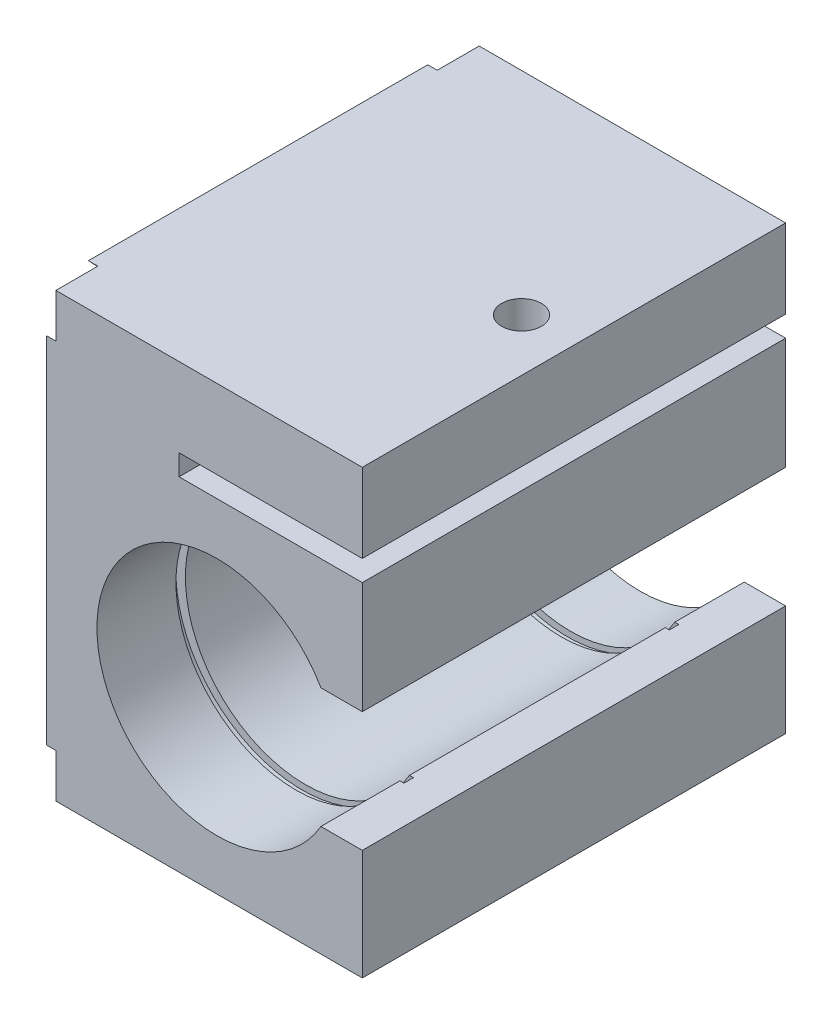
ISO-10303-21;
HEADER;
FILE_DESCRIPTION(('STEP AP214'),'2;1');
FILE_NAME('part.step','',(''),(''),'','','');
FILE_SCHEMA(('AUTOMOTIVE_DESIGN { 1 0 10303 214 1 1 1 1 }'));
ENDSEC;
DATA;
#1=APPLICATION_CONTEXT('core data for automotive mechanical design processes');
#2=APPLICATION_PROTOCOL_DEFINITION('international standard','automotive_design',2000,#1);
#3=PRODUCT_CONTEXT('',#1,'mechanical');
#4=PRODUCT('Part','Part','',(#3));
#5=PRODUCT_RELATED_PRODUCT_CATEGORY('part','',(#4));
#6=PRODUCT_DEFINITION_FORMATION('','',#4);
#7=PRODUCT_DEFINITION_CONTEXT('part definition',#1,'design');
#8=PRODUCT_DEFINITION('design','',#6,#7);
#9=PRODUCT_DEFINITION_SHAPE('','',#8);
#10=(LENGTH_UNIT() NAMED_UNIT(*) SI_UNIT(.MILLI.,.METRE.));
#11=(NAMED_UNIT(*) PLANE_ANGLE_UNIT() SI_UNIT($,.RADIAN.));
#12=(NAMED_UNIT(*) SI_UNIT($,.STERADIAN.) SOLID_ANGLE_UNIT());
#13=UNCERTAINTY_MEASURE_WITH_UNIT(LENGTH_MEASURE(1.E-05),#10,'distance_accuracy_value','');
#14=(GEOMETRIC_REPRESENTATION_CONTEXT(3) GLOBAL_UNCERTAINTY_ASSIGNED_CONTEXT((#13)) GLOBAL_UNIT_ASSIGNED_CONTEXT((#10,
#11,#12)) REPRESENTATION_CONTEXT('',''));
#15=CARTESIAN_POINT('',(0.,0.,0.));
#16=DIRECTION('',(0.,0.,1.));
#17=DIRECTION('',(1.,0.,0.));
#18=AXIS2_PLACEMENT_3D('',#15,#16,#17);
#19=CARTESIAN_POINT('',(27.,27.,67.));
#20=DIRECTION('',(0.,0.,-1.));
#21=DIRECTION('',(-1.,0.,0.));
#22=AXIS2_PLACEMENT_3D('',#19,#20,#21);
#23=CYLINDRICAL_SURFACE('',#22,19.);
#24=DIRECTION('',(0.,0.,-1.));
#25=VECTOR('',#24,1.);
#26=CARTESIAN_POINT('',(43.4544826719043,17.5,67.));
#27=LINE('',#26,#25);
#28=CARTESIAN_POINT('',(43.4544826719043,17.5,53.));
#29=VERTEX_POINT('',#28);
#30=CARTESIAN_POINT('',(43.4544826719043,17.5,12.5));
#31=VERTEX_POINT('',#30);
#32=EDGE_CURVE('E309',#29,#31,#27,.T.);
#33=ORIENTED_EDGE('',*,*,#32,.T.);
#34=CARTESIAN_POINT('',(27.,27.,12.5));
#35=DIRECTION('',(0.,0.,1.));
#36=DIRECTION('',(1.,0.,0.));
#37=AXIS2_PLACEMENT_3D('',#34,#35,#36);
#38=CIRCLE('',#37,19.);
#39=CARTESIAN_POINT('',(43.4544826719043,36.5,12.5));
#40=VERTEX_POINT('',#39);
#41=EDGE_CURVE('E476',#31,#40,#38,.F.);
#42=ORIENTED_EDGE('',*,*,#41,.T.);
#43=DIRECTION('',(0.,0.,-1.));
#44=VECTOR('',#43,1.);
#45=CARTESIAN_POINT('',(43.4544826719043,36.5,67.));
#46=LINE('',#45,#44);
#47=CARTESIAN_POINT('',(43.4544826719043,36.5,53.));
#48=VERTEX_POINT('',#47);
#49=EDGE_CURVE('E314',#48,#40,#46,.T.);
#50=ORIENTED_EDGE('',*,*,#49,.F.);
#51=CARTESIAN_POINT('',(27.,27.,53.));
#52=DIRECTION('',(0.,0.,-1.));
#53=DIRECTION('',(-1.,0.,0.));
#54=AXIS2_PLACEMENT_3D('',#51,#52,#53);
#55=CIRCLE('',#54,19.);
#56=EDGE_CURVE('E60',#48,#29,#55,.F.);
#57=ORIENTED_EDGE('',*,*,#56,.T.);
#58=EDGE_LOOP('',(#33,#42,#50,#57));
#59=FACE_BOUND('',#58,.T.);
#60=ADVANCED_FACE('F37',(#59),#23,.F.);
#61=CARTESIAN_POINT('',(43.4544826719043,17.5,67.));
#62=VERTEX_POINT('',#61);
#63=CARTESIAN_POINT('',(43.4544826719043,17.5,54.5));
#64=VERTEX_POINT('',#63);
#65=EDGE_CURVE('E306',#62,#64,#27,.T.);
#66=ORIENTED_EDGE('',*,*,#65,.T.);
#67=CARTESIAN_POINT('',(27.,27.,54.5));
#68=DIRECTION('',(0.,0.,1.));
#69=DIRECTION('',(1.,0.,0.));
#70=AXIS2_PLACEMENT_3D('',#67,#68,#69);
#71=CIRCLE('',#70,19.);
#72=CARTESIAN_POINT('',(43.4544826719043,36.5,54.5));
#73=VERTEX_POINT('',#72);
#74=EDGE_CURVE('E457',#64,#73,#71,.F.);
#75=ORIENTED_EDGE('',*,*,#74,.T.);
#76=CARTESIAN_POINT('',(43.4544826719043,36.5,67.));
#77=VERTEX_POINT('',#76);
#78=EDGE_CURVE('E311',#77,#73,#46,.T.);
#79=ORIENTED_EDGE('',*,*,#78,.F.);
#80=CARTESIAN_POINT('',(27.,27.,67.));
#81=DIRECTION('',(0.,0.,-1.));
#82=DIRECTION('',(1.,0.,0.));
#83=AXIS2_PLACEMENT_3D('',#80,#81,#82);
#84=CIRCLE('',#83,19.);
#85=EDGE_CURVE('E382',#62,#77,#84,.T.);
#86=ORIENTED_EDGE('',*,*,#85,.F.);
#87=EDGE_LOOP('',(#66,#75,#79,#86));
#88=FACE_BOUND('',#87,.T.);
#89=ADVANCED_FACE('F507',(#88),#23,.F.);
#90=CARTESIAN_POINT('',(0.,0.,67.));
#91=DIRECTION('',(1.,0.,0.));
#92=DIRECTION('',(0.,0.,-1.));
#93=AXIS2_PLACEMENT_3D('',#90,#91,#92);
#94=PLANE('',#93);
#95=DIRECTION('',(0.,0.,-1.));
#96=VECTOR('',#95,1.);
#97=CARTESIAN_POINT('',(0.,70.,67.));
#98=LINE('',#97,#96);
#99=CARTESIAN_POINT('',(0.,70.,60.355644408636));
#100=VERTEX_POINT('',#99);
#101=CARTESIAN_POINT('',(0.,70.,6.644355591364));
#102=VERTEX_POINT('',#101);
#103=EDGE_CURVE('E334',#100,#102,#98,.T.);
#104=ORIENTED_EDGE('',*,*,#103,.T.);
#105=DIRECTION('',(0.,0.722417687313246,-0.691456929285535));
#106=VECTOR('',#105,1.);
#107=CARTESIAN_POINT('',(0.,73.3189932605706,3.4676048991036));
#108=LINE('',#107,#106);
#109=CARTESIAN_POINT('',(0.,41.9418640506788,33.5));
#110=VERTEX_POINT('',#109);
#111=EDGE_CURVE('E435',#110,#102,#108,.T.);
#112=ORIENTED_EDGE('',*,*,#111,.F.);
#113=DIRECTION('',(0.,-0.722417687313246,-0.691456929285535));
#114=VECTOR('',#113,1.);
#115=CARTESIAN_POINT('',(0.,73.318993260571,63.5323951008968));
#116=LINE('',#115,#114);
#117=EDGE_CURVE('E420',#100,#110,#116,.T.);
#118=ORIENTED_EDGE('',*,*,#117,.F.);
#119=EDGE_LOOP('',(#104,#112,#118));
#120=FACE_BOUND('',#119,.T.);
#121=ADVANCED_FACE('F514',(#120),#94,.F.);
#122=DIRECTION('',(0.,-1.,0.));
#123=VECTOR('',#122,1.);
#124=CARTESIAN_POINT('',(0.,0.,67.));
#125=LINE('',#124,#123);
#126=CARTESIAN_POINT('',(0.,63.0581359493212,67.));
#127=VERTEX_POINT('',#126);
#128=CARTESIAN_POINT('',(0.,6.94186405067878,67.));
#129=VERTEX_POINT('',#128);
#130=EDGE_CURVE('E341',#127,#129,#125,.T.);
#131=ORIENTED_EDGE('',*,*,#130,.F.);
#132=DIRECTION('',(0.,0.722417687313245,0.691456929285535));
#133=VECTOR('',#132,1.);
#134=CARTESIAN_POINT('',(0.,66.6810067394298,70.467604899104));
#135=LINE('',#134,#133);
#136=CARTESIAN_POINT('',(0.,35.,40.144355591364));
#137=VERTEX_POINT('',#136);
#138=EDGE_CURVE('E423',#137,#127,#135,.T.);
#139=ORIENTED_EDGE('',*,*,#138,.F.);
#140=DIRECTION('',(0.,0.722417687313246,-0.691456929285535));
#141=VECTOR('',#140,1.);
#142=CARTESIAN_POINT('',(0.,35.,40.144355591364));
#143=LINE('',#142,#141);
#144=EDGE_CURVE('E425',#129,#137,#143,.T.);
#145=ORIENTED_EDGE('',*,*,#144,.F.);
#146=EDGE_LOOP('',(#131,#139,#145));
#147=FACE_BOUND('',#146,.T.);
#148=ADVANCED_FACE('F614',(#147),#94,.F.);
#149=DIRECTION('',(0.,0.,-1.));
#150=VECTOR('',#149,1.);
#151=CARTESIAN_POINT('',(0.,0.,67.));
#152=LINE('',#151,#150);
#153=CARTESIAN_POINT('',(0.,0.,60.355644408636));
#154=VERTEX_POINT('',#153);
#155=CARTESIAN_POINT('',(0.,0.,6.644355591364));
#156=VERTEX_POINT('',#155);
#157=EDGE_CURVE('E297',#154,#156,#152,.T.);
#158=ORIENTED_EDGE('',*,*,#157,.F.);
#159=DIRECTION('',(0.,-0.722417687313246,0.691456929285535));
#160=VECTOR('',#159,1.);
#161=CARTESIAN_POINT('',(0.,28.0581359493212,33.5));
#162=LINE('',#161,#160);
#163=CARTESIAN_POINT('',(0.,28.0581359493212,33.5));
#164=VERTEX_POINT('',#163);
#165=EDGE_CURVE('E427',#164,#154,#162,.T.);
#166=ORIENTED_EDGE('',*,*,#165,.F.);
#167=DIRECTION('',(0.,0.722417687313246,0.691456929285535));
#168=VECTOR('',#167,1.);
#169=CARTESIAN_POINT('',(0.,28.0581359493212,33.5));
#170=LINE('',#169,#168);
#171=EDGE_CURVE('E429',#156,#164,#170,.T.);
#172=ORIENTED_EDGE('',*,*,#171,.F.);
#173=EDGE_LOOP('',(#158,#166,#172));
#174=FACE_BOUND('',#173,.T.);
#175=ADVANCED_FACE('F535',(#174),#94,.F.);
#176=DIRECTION('',(0.,-1.,0.));
#177=VECTOR('',#176,1.);
#178=CARTESIAN_POINT('',(0.,0.,0.));
#179=LINE('',#178,#177);
#180=CARTESIAN_POINT('',(0.,63.0581359493212,0.));
#181=VERTEX_POINT('',#180);
#182=CARTESIAN_POINT('',(0.,6.94186405067879,0.));
#183=VERTEX_POINT('',#182);
#184=EDGE_CURVE('E364',#181,#183,#179,.T.);
#185=ORIENTED_EDGE('',*,*,#184,.T.);
#186=DIRECTION('',(0.,-0.722417687313246,-0.691456929285535));
#187=VECTOR('',#186,1.);
#188=CARTESIAN_POINT('',(0.,35.,26.855644408636));
#189=LINE('',#188,#187);
#190=CARTESIAN_POINT('',(0.,35.,26.855644408636));
#191=VERTEX_POINT('',#190);
#192=EDGE_CURVE('E431',#191,#183,#189,.T.);
#193=ORIENTED_EDGE('',*,*,#192,.F.);
#194=DIRECTION('',(0.,-0.722417687313245,0.691456929285535));
#195=VECTOR('',#194,1.);
#196=CARTESIAN_POINT('',(0.,66.6810067394294,-3.46760489910359));
#197=LINE('',#196,#195);
#198=EDGE_CURVE('E433',#181,#191,#197,.T.);
#199=ORIENTED_EDGE('',*,*,#198,.F.);
#200=EDGE_LOOP('',(#185,#193,#199));
#201=FACE_BOUND('',#200,.T.);
#202=ADVANCED_FACE('F39',(#201),#94,.F.);
#203=CARTESIAN_POINT('',(0.,0.,67.));
#204=DIRECTION('',(0.,1.,0.));
#205=DIRECTION('',(0.,0.,1.));
#206=AXIS2_PLACEMENT_3D('',#203,#204,#205);
#207=PLANE('',#206);
#208=ORIENTED_EDGE('',*,*,#157,.T.);
#209=DIRECTION('',(1.,0.,0.));
#210=VECTOR('',#209,1.);
#211=CARTESIAN_POINT('',(0.,0.,6.644355591364));
#212=LINE('',#211,#210);
#213=CARTESIAN_POINT('',(1.5,0.,6.644355591364));
#214=VERTEX_POINT('',#213);
#215=EDGE_CURVE('E272',#156,#214,#212,.T.);
#216=ORIENTED_EDGE('',*,*,#215,.T.);
#217=DIRECTION('',(0.,0.,1.));
#218=VECTOR('',#217,1.);
#219=CARTESIAN_POINT('',(1.5,0.,67.));
#220=LINE('',#219,#218);
#221=CARTESIAN_POINT('',(1.5,0.,0.));
#222=VERTEX_POINT('',#221);
#223=EDGE_CURVE('E405',#222,#214,#220,.T.);
#224=ORIENTED_EDGE('',*,*,#223,.F.);
#225=DIRECTION('',(1.,0.,0.));
#226=VECTOR('',#225,1.);
#227=CARTESIAN_POINT('',(0.,0.,0.));
#228=LINE('',#227,#226);
#229=CARTESIAN_POINT('',(50.,0.,0.));
#230=VERTEX_POINT('',#229);
#231=EDGE_CURVE('E362',#222,#230,#228,.T.);
#232=ORIENTED_EDGE('',*,*,#231,.T.);
#233=DIRECTION('',(0.,0.,-1.));
#234=VECTOR('',#233,1.);
#235=CARTESIAN_POINT('',(50.,0.,67.));
#236=LINE('',#235,#234);
#237=CARTESIAN_POINT('',(50.,0.,67.));
#238=VERTEX_POINT('',#237);
#239=EDGE_CURVE('E300',#238,#230,#236,.T.);
#240=ORIENTED_EDGE('',*,*,#239,.F.);
#241=DIRECTION('',(1.,0.,0.));
#242=VECTOR('',#241,1.);
#243=CARTESIAN_POINT('',(0.,0.,67.));
#244=LINE('',#243,#242);
#245=CARTESIAN_POINT('',(1.5,0.,67.));
#246=VERTEX_POINT('',#245);
#247=EDGE_CURVE('E388',#246,#238,#244,.T.);
#248=ORIENTED_EDGE('',*,*,#247,.F.);
#249=CARTESIAN_POINT('',(1.5,0.,60.355644408636));
#250=VERTEX_POINT('',#249);
#251=EDGE_CURVE('E401',#250,#246,#220,.T.);
#252=ORIENTED_EDGE('',*,*,#251,.F.);
#253=DIRECTION('',(-1.,0.,0.));
#254=VECTOR('',#253,1.);
#255=CARTESIAN_POINT('',(0.,0.,60.355644408636));
#256=LINE('',#255,#254);
#257=EDGE_CURVE('E275',#250,#154,#256,.T.);
#258=ORIENTED_EDGE('',*,*,#257,.T.);
#259=EDGE_LOOP('',(#208,#216,#224,#232,#240,#248,#252,#258));
#260=FACE_BOUND('',#259,.T.);
#261=ADVANCED_FACE('F527',(#260),#207,.F.);
#262=CARTESIAN_POINT('',(50.,0.,67.));
#263=DIRECTION('',(-1.,0.,0.));
#264=DIRECTION('',(0.,0.,1.));
#265=AXIS2_PLACEMENT_3D('',#262,#263,#264);
#266=PLANE('',#265);
#267=DIRECTION('',(0.,1.,0.));
#268=VECTOR('',#267,1.);
#269=CARTESIAN_POINT('',(50.,0.,0.));
#270=LINE('',#269,#268);
#271=CARTESIAN_POINT('',(50.,17.5,0.));
#272=VERTEX_POINT('',#271);
#273=EDGE_CURVE('E360',#230,#272,#270,.T.);
#274=ORIENTED_EDGE('',*,*,#273,.T.);
#275=DIRECTION('',(0.,0.,-1.));
#276=VECTOR('',#275,1.);
#277=CARTESIAN_POINT('',(50.,17.5,67.));
#278=LINE('',#277,#276);
#279=CARTESIAN_POINT('',(50.,17.5,67.));
#280=VERTEX_POINT('',#279);
#281=EDGE_CURVE('E303',#280,#272,#278,.T.);
#282=ORIENTED_EDGE('',*,*,#281,.F.);
#283=DIRECTION('',(0.,1.,0.));
#284=VECTOR('',#283,1.);
#285=CARTESIAN_POINT('',(50.,0.,67.));
#286=LINE('',#285,#284);
#287=EDGE_CURVE('E386',#238,#280,#286,.T.);
#288=ORIENTED_EDGE('',*,*,#287,.F.);
#289=ORIENTED_EDGE('',*,*,#239,.T.);
#290=EDGE_LOOP('',(#274,#282,#288,#289));
#291=FACE_BOUND('',#290,.T.);
#292=ADVANCED_FACE('F523',(#291),#266,.F.);
#293=CARTESIAN_POINT('',(43.4544826719043,17.5,67.));
#294=DIRECTION('',(0.,-1.,0.));
#295=DIRECTION('',(0.,0.,-1.));
#296=AXIS2_PLACEMENT_3D('',#293,#294,#295);
#297=PLANE('',#296);
#298=DIRECTION('',(0.,0.,1.));
#299=VECTOR('',#298,1.);
#300=CARTESIAN_POINT('',(44.0910662523071,17.5,24.2363093368867));
#301=LINE('',#300,#299);
#302=CARTESIAN_POINT('',(44.0910662523071,17.5,11.));
#303=VERTEX_POINT('',#302);
#304=CARTESIAN_POINT('',(44.0910662523071,17.5,12.5));
#305=VERTEX_POINT('',#304);
#306=EDGE_CURVE('E259',#303,#305,#301,.T.);
#307=ORIENTED_EDGE('',*,*,#306,.T.);
#308=DIRECTION('',(-1.,0.,0.));
#309=VECTOR('',#308,1.);
#310=CARTESIAN_POINT('',(43.4544826719043,17.5,12.5));
#311=LINE('',#310,#309);
#312=EDGE_CURVE('E473',#305,#31,#311,.T.);
#313=ORIENTED_EDGE('',*,*,#312,.T.);
#314=ORIENTED_EDGE('',*,*,#32,.F.);
#315=DIRECTION('',(1.,0.,0.));
#316=VECTOR('',#315,1.);
#317=CARTESIAN_POINT('',(43.4544826719043,17.5,53.));
#318=LINE('',#317,#316);
#319=CARTESIAN_POINT('',(44.0910662523071,17.5,53.));
#320=VERTEX_POINT('',#319);
#321=EDGE_CURVE('E463',#29,#320,#318,.T.);
#322=ORIENTED_EDGE('',*,*,#321,.T.);
#323=DIRECTION('',(0.,0.,1.));
#324=VECTOR('',#323,1.);
#325=CARTESIAN_POINT('',(44.0910662523071,17.5,66.2363093368867));
#326=LINE('',#325,#324);
#327=CARTESIAN_POINT('',(44.0910662523071,17.5,54.5));
#328=VERTEX_POINT('',#327);
#329=EDGE_CURVE('E460',#320,#328,#326,.T.);
#330=ORIENTED_EDGE('',*,*,#329,.T.);
#331=DIRECTION('',(-1.,0.,0.));
#332=VECTOR('',#331,1.);
#333=CARTESIAN_POINT('',(43.4544826719043,17.5,54.5));
#334=LINE('',#333,#332);
#335=EDGE_CURVE('E437',#328,#64,#334,.T.);
#336=ORIENTED_EDGE('',*,*,#335,.T.);
#337=ORIENTED_EDGE('',*,*,#65,.F.);
#338=DIRECTION('',(-1.,0.,0.));
#339=VECTOR('',#338,1.);
#340=CARTESIAN_POINT('',(43.4544826719043,17.5,67.));
#341=LINE('',#340,#339);
#342=EDGE_CURVE('E384',#280,#62,#341,.T.);
#343=ORIENTED_EDGE('',*,*,#342,.F.);
#344=ORIENTED_EDGE('',*,*,#281,.T.);
#345=DIRECTION('',(-1.,0.,0.));
#346=VECTOR('',#345,1.);
#347=CARTESIAN_POINT('',(43.4544826719043,17.5,0.));
#348=LINE('',#347,#346);
#349=CARTESIAN_POINT('',(43.4544826719043,17.5,0.));
#350=VERTEX_POINT('',#349);
#351=EDGE_CURVE('E357',#272,#350,#348,.T.);
#352=ORIENTED_EDGE('',*,*,#351,.T.);
#353=CARTESIAN_POINT('',(43.4544826719043,17.5,11.));
#354=VERTEX_POINT('',#353);
#355=EDGE_CURVE('E310',#354,#350,#27,.T.);
#356=ORIENTED_EDGE('',*,*,#355,.F.);
#357=DIRECTION('',(1.,0.,0.));
#358=VECTOR('',#357,1.);
#359=CARTESIAN_POINT('',(43.4544826719043,17.5,11.));
#360=LINE('',#359,#358);
#361=EDGE_CURVE('E480',#354,#303,#360,.T.);
#362=ORIENTED_EDGE('',*,*,#361,.T.);
#363=EDGE_LOOP('',(#307,#313,#314,#322,#330,#336,#337,#343,#344,#352,#356,#362));
#364=FACE_BOUND('',#363,.T.);
#365=ADVANCED_FACE('F485',(#364),#297,.F.);
#366=CARTESIAN_POINT('',(43.4544826719043,36.5,11.));
#367=VERTEX_POINT('',#366);
#368=CARTESIAN_POINT('',(43.4544826719043,36.5,0.));
#369=VERTEX_POINT('',#368);
#370=EDGE_CURVE('E315',#367,#369,#46,.T.);
#371=ORIENTED_EDGE('',*,*,#370,.F.);
#372=CARTESIAN_POINT('',(27.,27.,11.));
#373=DIRECTION('',(0.,0.,-1.));
#374=DIRECTION('',(-1.,0.,0.));
#375=AXIS2_PLACEMENT_3D('',#372,#373,#374);
#376=CIRCLE('',#375,19.);
#377=EDGE_CURVE('E52',#367,#354,#376,.F.);
#378=ORIENTED_EDGE('',*,*,#377,.T.);
#379=ORIENTED_EDGE('',*,*,#355,.T.);
#380=CARTESIAN_POINT('',(27.,27.,0.));
#381=DIRECTION('',(0.,0.,-1.));
#382=DIRECTION('',(1.,0.,0.));
#383=AXIS2_PLACEMENT_3D('',#380,#381,#382);
#384=CIRCLE('',#383,19.);
#385=EDGE_CURVE('E354',#350,#369,#384,.T.);
#386=ORIENTED_EDGE('',*,*,#385,.T.);
#387=EDGE_LOOP('',(#371,#378,#379,#386));
#388=FACE_BOUND('',#387,.T.);
#389=ADVANCED_FACE('F490',(#388),#23,.F.);
#390=CARTESIAN_POINT('',(50.,36.5,67.));
#391=DIRECTION('',(0.,1.,0.));
#392=DIRECTION('',(0.,0.,1.));
#393=AXIS2_PLACEMENT_3D('',#390,#391,#392);
#394=PLANE('',#393);
#395=ORIENTED_EDGE('',*,*,#49,.T.);
#396=DIRECTION('',(1.,0.,0.));
#397=VECTOR('',#396,1.);
#398=CARTESIAN_POINT('',(50.,36.5,12.5));
#399=LINE('',#398,#397);
#400=CARTESIAN_POINT('',(44.0910662523071,36.5,12.5));
#401=VERTEX_POINT('',#400);
#402=EDGE_CURVE('E11',#40,#401,#399,.T.);
#403=ORIENTED_EDGE('',*,*,#402,.T.);
#404=DIRECTION('',(0.,0.,1.));
#405=VECTOR('',#404,1.);
#406=CARTESIAN_POINT('',(44.0910662523071,36.5,24.2363093368867));
#407=LINE('',#406,#405);
#408=CARTESIAN_POINT('',(44.0910662523071,36.5,11.));
#409=VERTEX_POINT('',#408);
#410=EDGE_CURVE('E45',#401,#409,#407,.F.);
#411=ORIENTED_EDGE('',*,*,#410,.T.);
#412=DIRECTION('',(-1.,0.,0.));
#413=VECTOR('',#412,1.);
#414=CARTESIAN_POINT('',(50.,36.5,11.));
#415=LINE('',#414,#413);
#416=EDGE_CURVE('E244',#409,#367,#415,.T.);
#417=ORIENTED_EDGE('',*,*,#416,.T.);
#418=ORIENTED_EDGE('',*,*,#370,.T.);
#419=DIRECTION('',(1.,0.,0.));
#420=VECTOR('',#419,1.);
#421=CARTESIAN_POINT('',(50.,36.5,0.));
#422=LINE('',#421,#420);
#423=CARTESIAN_POINT('',(50.,36.5,0.));
#424=VERTEX_POINT('',#423);
#425=EDGE_CURVE('E352',#369,#424,#422,.T.);
#426=ORIENTED_EDGE('',*,*,#425,.T.);
#427=DIRECTION('',(0.,0.,-1.));
#428=VECTOR('',#427,1.);
#429=CARTESIAN_POINT('',(50.,36.5,67.));
#430=LINE('',#429,#428);
#431=CARTESIAN_POINT('',(50.,36.5,67.));
#432=VERTEX_POINT('',#431);
#433=EDGE_CURVE('E316',#432,#424,#430,.T.);
#434=ORIENTED_EDGE('',*,*,#433,.F.);
#435=DIRECTION('',(1.,0.,0.));
#436=VECTOR('',#435,1.);
#437=CARTESIAN_POINT('',(50.,36.5,67.));
#438=LINE('',#437,#436);
#439=EDGE_CURVE('E380',#77,#432,#438,.T.);
#440=ORIENTED_EDGE('',*,*,#439,.F.);
#441=ORIENTED_EDGE('',*,*,#78,.T.);
#442=DIRECTION('',(1.,0.,0.));
#443=VECTOR('',#442,1.);
#444=CARTESIAN_POINT('',(50.,36.5,54.5));
#445=LINE('',#444,#443);
#446=CARTESIAN_POINT('',(44.0910662523071,36.5,54.5));
#447=VERTEX_POINT('',#446);
#448=EDGE_CURVE('E252',#73,#447,#445,.T.);
#449=ORIENTED_EDGE('',*,*,#448,.T.);
#450=DIRECTION('',(0.,0.,1.));
#451=VECTOR('',#450,1.);
#452=CARTESIAN_POINT('',(44.0910662523071,36.5,66.2363093368867));
#453=LINE('',#452,#451);
#454=CARTESIAN_POINT('',(44.0910662523071,36.5,53.));
#455=VERTEX_POINT('',#454);
#456=EDGE_CURVE('E267',#447,#455,#453,.F.);
#457=ORIENTED_EDGE('',*,*,#456,.T.);
#458=DIRECTION('',(-1.,0.,0.));
#459=VECTOR('',#458,1.);
#460=CARTESIAN_POINT('',(50.,36.5,53.));
#461=LINE('',#460,#459);
#462=EDGE_CURVE('E270',#455,#48,#461,.T.);
#463=ORIENTED_EDGE('',*,*,#462,.T.);
#464=EDGE_LOOP('',(#395,#403,#411,#417,#418,#426,#434,#440,#441,#449,#457,#463));
#465=FACE_BOUND('',#464,.T.);
#466=ADVANCED_FACE('F263',(#465),#394,.F.);
#467=CARTESIAN_POINT('',(50.,36.5,67.));
#468=DIRECTION('',(-1.,0.,0.));
#469=DIRECTION('',(0.,0.,1.));
#470=AXIS2_PLACEMENT_3D('',#467,#468,#469);
#471=PLANE('',#470);
#472=DIRECTION('',(0.,1.,0.));
#473=VECTOR('',#472,1.);
#474=CARTESIAN_POINT('',(50.,36.5,0.));
#475=LINE('',#474,#473);
#476=CARTESIAN_POINT('',(50.,54.2,0.));
#477=VERTEX_POINT('',#476);
#478=EDGE_CURVE('E350',#424,#477,#475,.T.);
#479=ORIENTED_EDGE('',*,*,#478,.T.);
#480=DIRECTION('',(0.,0.,-1.));
#481=VECTOR('',#480,1.);
#482=CARTESIAN_POINT('',(50.,54.2,67.));
#483=LINE('',#482,#481);
#484=CARTESIAN_POINT('',(50.,54.2,67.));
#485=VERTEX_POINT('',#484);
#486=EDGE_CURVE('E319',#485,#477,#483,.T.);
#487=ORIENTED_EDGE('',*,*,#486,.F.);
#488=DIRECTION('',(0.,1.,0.));
#489=VECTOR('',#488,1.);
#490=CARTESIAN_POINT('',(50.,36.5,67.));
#491=LINE('',#490,#489);
#492=EDGE_CURVE('E378',#432,#485,#491,.T.);
#493=ORIENTED_EDGE('',*,*,#492,.F.);
#494=ORIENTED_EDGE('',*,*,#433,.T.);
#495=EDGE_LOOP('',(#479,#487,#493,#494));
#496=FACE_BOUND('',#495,.T.);
#497=ADVANCED_FACE('F522',(#496),#471,.F.);
#498=CARTESIAN_POINT('',(50.,54.2,67.));
#499=DIRECTION('',(0.,-1.,0.));
#500=DIRECTION('',(1.,0.,0.));
#501=AXIS2_PLACEMENT_3D('',#498,#499,#500);
#502=PLANE('',#501);
#503=DIRECTION('',(-1.,0.,0.));
#504=VECTOR('',#503,1.);
#505=CARTESIAN_POINT('',(50.,54.2,0.));
#506=LINE('',#505,#504);
#507=CARTESIAN_POINT('',(21.,54.2,0.));
#508=VERTEX_POINT('',#507);
#509=EDGE_CURVE('E348',#477,#508,#506,.T.);
#510=ORIENTED_EDGE('',*,*,#509,.T.);
#511=DIRECTION('',(0.,0.,-1.));
#512=VECTOR('',#511,1.);
#513=CARTESIAN_POINT('',(21.,54.2,67.));
#514=LINE('',#513,#512);
#515=CARTESIAN_POINT('',(21.,54.2,67.));
#516=VERTEX_POINT('',#515);
#517=EDGE_CURVE('E322',#516,#508,#514,.T.);
#518=ORIENTED_EDGE('',*,*,#517,.F.);
#519=DIRECTION('',(-1.,0.,0.));
#520=VECTOR('',#519,1.);
#521=CARTESIAN_POINT('',(50.,54.2,67.));
#522=LINE('',#521,#520);
#523=EDGE_CURVE('E376',#485,#516,#522,.T.);
#524=ORIENTED_EDGE('',*,*,#523,.F.);
#525=ORIENTED_EDGE('',*,*,#486,.T.);
#526=EDGE_LOOP('',(#510,#518,#524,#525));
#527=FACE_BOUND('',#526,.T.);
#528=ADVANCED_FACE('F846',(#527),#502,.F.);
#529=CARTESIAN_POINT('',(21.,57.5,67.));
#530=DIRECTION('',(-1.,0.,0.));
#531=DIRECTION('',(0.,0.,1.));
#532=AXIS2_PLACEMENT_3D('',#529,#530,#531);
#533=PLANE('',#532);
#534=DIRECTION('',(0.,1.,0.));
#535=VECTOR('',#534,1.);
#536=CARTESIAN_POINT('',(21.,57.5,0.));
#537=LINE('',#536,#535);
#538=CARTESIAN_POINT('',(21.,57.5,0.));
#539=VERTEX_POINT('',#538);
#540=EDGE_CURVE('E346',#508,#539,#537,.T.);
#541=ORIENTED_EDGE('',*,*,#540,.T.);
#542=DIRECTION('',(0.,0.,-1.));
#543=VECTOR('',#542,1.);
#544=CARTESIAN_POINT('',(21.,57.5,67.));
#545=LINE('',#544,#543);
#546=CARTESIAN_POINT('',(21.,57.5,67.));
#547=VERTEX_POINT('',#546);
#548=EDGE_CURVE('E325',#547,#539,#545,.T.);
#549=ORIENTED_EDGE('',*,*,#548,.F.);
#550=DIRECTION('',(0.,1.,0.));
#551=VECTOR('',#550,1.);
#552=CARTESIAN_POINT('',(21.,57.5,67.));
#553=LINE('',#552,#551);
#554=EDGE_CURVE('E374',#516,#547,#553,.T.);
#555=ORIENTED_EDGE('',*,*,#554,.F.);
#556=ORIENTED_EDGE('',*,*,#517,.T.);
#557=EDGE_LOOP('',(#541,#549,#555,#556));
#558=FACE_BOUND('',#557,.T.);
#559=ADVANCED_FACE('F854',(#558),#533,.F.);
#560=CARTESIAN_POINT('',(50.,57.5,67.));
#561=DIRECTION('',(0.,1.,0.));
#562=DIRECTION('',(-1.,0.,0.));
#563=AXIS2_PLACEMENT_3D('',#560,#561,#562);
#564=PLANE('',#563);
#565=CARTESIAN_POINT('',(41.7,57.5,33.5));
#566=DIRECTION('',(0.,1.,0.));
#567=DIRECTION('',(-1.,0.,0.));
#568=AXIS2_PLACEMENT_3D('',#565,#566,#567);
#569=CIRCLE('',#568,3.15);
#570=CARTESIAN_POINT('',(38.55,57.5,33.5));
#571=VERTEX_POINT('',#570);
#572=EDGE_CURVE('E394',#571,#571,#569,.F.);
#573=ORIENTED_EDGE('',*,*,#572,.F.);
#574=EDGE_LOOP('',(#573));
#575=FACE_BOUND('',#574,.T.);
#576=DIRECTION('',(1.,0.,0.));
#577=VECTOR('',#576,1.);
#578=CARTESIAN_POINT('',(50.,57.5,0.));
#579=LINE('',#578,#577);
#580=CARTESIAN_POINT('',(50.,57.5,0.));
#581=VERTEX_POINT('',#580);
#582=EDGE_CURVE('E344',#539,#581,#579,.T.);
#583=ORIENTED_EDGE('',*,*,#582,.T.);
#584=DIRECTION('',(0.,0.,-1.));
#585=VECTOR('',#584,1.);
#586=CARTESIAN_POINT('',(50.,57.5,67.));
#587=LINE('',#586,#585);
#588=CARTESIAN_POINT('',(50.,57.5,67.));
#589=VERTEX_POINT('',#588);
#590=EDGE_CURVE('E328',#589,#581,#587,.T.);
#591=ORIENTED_EDGE('',*,*,#590,.F.);
#592=DIRECTION('',(1.,0.,0.));
#593=VECTOR('',#592,1.);
#594=CARTESIAN_POINT('',(50.,57.5,67.));
#595=LINE('',#594,#593);
#596=EDGE_CURVE('E372',#547,#589,#595,.T.);
#597=ORIENTED_EDGE('',*,*,#596,.F.);
#598=ORIENTED_EDGE('',*,*,#548,.T.);
#599=EDGE_LOOP('',(#583,#591,#597,#598));
#600=FACE_BOUND('',#599,.T.);
#601=ADVANCED_FACE('F862',(#575,#600),#564,.F.);
#602=CARTESIAN_POINT('',(50.,57.5,67.));
#603=DIRECTION('',(-1.,0.,0.));
#604=DIRECTION('',(0.,0.,1.));
#605=AXIS2_PLACEMENT_3D('',#602,#603,#604);
#606=PLANE('',#605);
#607=DIRECTION('',(0.,1.,0.));
#608=VECTOR('',#607,1.);
#609=CARTESIAN_POINT('',(50.,57.5,0.));
#610=LINE('',#609,#608);
#611=CARTESIAN_POINT('',(50.,70.,0.));
#612=VERTEX_POINT('',#611);
#613=EDGE_CURVE('E342',#581,#612,#610,.T.);
#614=ORIENTED_EDGE('',*,*,#613,.T.);
#615=DIRECTION('',(0.,0.,-1.));
#616=VECTOR('',#615,1.);
#617=CARTESIAN_POINT('',(50.,70.,67.));
#618=LINE('',#617,#616);
#619=CARTESIAN_POINT('',(50.,70.,67.));
#620=VERTEX_POINT('',#619);
#621=EDGE_CURVE('E331',#620,#612,#618,.T.);
#622=ORIENTED_EDGE('',*,*,#621,.F.);
#623=DIRECTION('',(0.,1.,0.));
#624=VECTOR('',#623,1.);
#625=CARTESIAN_POINT('',(50.,57.5,67.));
#626=LINE('',#625,#624);
#627=EDGE_CURVE('E370',#589,#620,#626,.T.);
#628=ORIENTED_EDGE('',*,*,#627,.F.);
#629=ORIENTED_EDGE('',*,*,#590,.T.);
#630=EDGE_LOOP('',(#614,#622,#628,#629));
#631=FACE_BOUND('',#630,.T.);
#632=ADVANCED_FACE('F663',(#631),#606,.F.);
#633=CARTESIAN_POINT('',(0.,70.,67.));
#634=DIRECTION('',(0.,-1.,0.));
#635=DIRECTION('',(0.,0.,-1.));
#636=AXIS2_PLACEMENT_3D('',#633,#634,#635);
#637=PLANE('',#636);
#638=CARTESIAN_POINT('',(41.7,70.,33.5));
#639=DIRECTION('',(0.,1.,0.));
#640=DIRECTION('',(0.,0.,1.));
#641=AXIS2_PLACEMENT_3D('',#638,#639,#640);
#642=CIRCLE('',#641,3.15);
#643=CARTESIAN_POINT('',(41.7,70.,36.65));
#644=VERTEX_POINT('',#643);
#645=EDGE_CURVE('E367',#644,#644,#642,.T.);
#646=ORIENTED_EDGE('',*,*,#645,.F.);
#647=EDGE_LOOP('',(#646));
#648=FACE_BOUND('',#647,.T.);
#649=ORIENTED_EDGE('',*,*,#103,.F.);
#650=DIRECTION('',(1.,0.,0.));
#651=VECTOR('',#650,1.);
#652=CARTESIAN_POINT('',(0.,70.,60.355644408636));
#653=LINE('',#652,#651);
#654=CARTESIAN_POINT('',(1.5,70.,60.355644408636));
#655=VERTEX_POINT('',#654);
#656=EDGE_CURVE('E278',#100,#655,#653,.T.);
#657=ORIENTED_EDGE('',*,*,#656,.T.);
#658=DIRECTION('',(0.,0.,-1.));
#659=VECTOR('',#658,1.);
#660=CARTESIAN_POINT('',(1.5,70.,67.));
#661=LINE('',#660,#659);
#662=CARTESIAN_POINT('',(1.5,70.0000000000008,67.));
#663=VERTEX_POINT('',#662);
#664=EDGE_CURVE('E397',#663,#655,#661,.T.);
#665=ORIENTED_EDGE('',*,*,#664,.F.);
#666=DIRECTION('',(-1.,0.,0.));
#667=VECTOR('',#666,1.);
#668=CARTESIAN_POINT('',(0.,70.,67.));
#669=LINE('',#668,#667);
#670=EDGE_CURVE('E337',#620,#663,#669,.T.);
#671=ORIENTED_EDGE('',*,*,#670,.F.);
#672=ORIENTED_EDGE('',*,*,#621,.T.);
#673=DIRECTION('',(-1.,0.,0.));
#674=VECTOR('',#673,1.);
#675=CARTESIAN_POINT('',(0.,70.,0.));
#676=LINE('',#675,#674);
#677=CARTESIAN_POINT('',(1.5,70.,0.));
#678=VERTEX_POINT('',#677);
#679=EDGE_CURVE('E338',#612,#678,#676,.T.);
#680=ORIENTED_EDGE('',*,*,#679,.T.);
#681=CARTESIAN_POINT('',(1.5,70.,6.644355591364));
#682=VERTEX_POINT('',#681);
#683=EDGE_CURVE('E402',#682,#678,#661,.T.);
#684=ORIENTED_EDGE('',*,*,#683,.F.);
#685=DIRECTION('',(-1.,0.,0.));
#686=VECTOR('',#685,1.);
#687=CARTESIAN_POINT('',(0.,70.,6.644355591364));
#688=LINE('',#687,#686);
#689=EDGE_CURVE('E281',#682,#102,#688,.T.);
#690=ORIENTED_EDGE('',*,*,#689,.T.);
#691=EDGE_LOOP('',(#649,#657,#665,#671,#672,#680,#684,#690));
#692=FACE_BOUND('',#691,.T.);
#693=ADVANCED_FACE('F567',(#648,#692),#637,.F.);
#694=CARTESIAN_POINT('',(27.,27.,67.));
#695=DIRECTION('',(0.,0.,1.));
#696=DIRECTION('',(1.,0.,0.));
#697=AXIS2_PLACEMENT_3D('',#694,#695,#696);
#698=PLANE('',#697);
#699=DIRECTION('',(1.,0.,0.));
#700=VECTOR('',#699,1.);
#701=CARTESIAN_POINT('',(27.,63.0581359493212,67.));
#702=LINE('',#701,#700);
#703=CARTESIAN_POINT('',(1.5,63.0581359493212,67.));
#704=VERTEX_POINT('',#703);
#705=EDGE_CURVE('E284',#127,#704,#702,.T.);
#706=ORIENTED_EDGE('',*,*,#705,.F.);
#707=ORIENTED_EDGE('',*,*,#130,.T.);
#708=DIRECTION('',(-1.,0.,0.));
#709=VECTOR('',#708,1.);
#710=CARTESIAN_POINT('',(27.,6.94186405067877,67.));
#711=LINE('',#710,#709);
#712=CARTESIAN_POINT('',(1.5,6.94186405067878,67.));
#713=VERTEX_POINT('',#712);
#714=EDGE_CURVE('E286',#713,#129,#711,.T.);
#715=ORIENTED_EDGE('',*,*,#714,.F.);
#716=DIRECTION('',(0.,-1.,0.));
#717=VECTOR('',#716,1.);
#718=CARTESIAN_POINT('',(1.5,27.,67.));
#719=LINE('',#718,#717);
#720=EDGE_CURVE('E398',#713,#246,#719,.T.);
#721=ORIENTED_EDGE('',*,*,#720,.T.);
#722=ORIENTED_EDGE('',*,*,#247,.T.);
#723=ORIENTED_EDGE('',*,*,#287,.T.);
#724=ORIENTED_EDGE('',*,*,#342,.T.);
#725=ORIENTED_EDGE('',*,*,#85,.T.);
#726=ORIENTED_EDGE('',*,*,#439,.T.);
#727=ORIENTED_EDGE('',*,*,#492,.T.);
#728=ORIENTED_EDGE('',*,*,#523,.T.);
#729=ORIENTED_EDGE('',*,*,#554,.T.);
#730=ORIENTED_EDGE('',*,*,#596,.T.);
#731=ORIENTED_EDGE('',*,*,#627,.T.);
#732=ORIENTED_EDGE('',*,*,#670,.T.);
#733=EDGE_CURVE('E403',#663,#704,#719,.T.);
#734=ORIENTED_EDGE('',*,*,#733,.T.);
#735=EDGE_LOOP('',(#706,#707,#715,#721,#722,#723,#724,#725,#726,#727,#728,#729,#730,#731,#732,#734));
#736=FACE_BOUND('',#735,.T.);
#737=ADVANCED_FACE('F600',(#736),#698,.T.);
#738=CARTESIAN_POINT('',(27.,27.,0.));
#739=DIRECTION('',(0.,0.,1.));
#740=DIRECTION('',(1.,0.,0.));
#741=AXIS2_PLACEMENT_3D('',#738,#739,#740);
#742=PLANE('',#741);
#743=ORIENTED_EDGE('',*,*,#184,.F.);
#744=DIRECTION('',(1.,0.,0.));
#745=VECTOR('',#744,1.);
#746=CARTESIAN_POINT('',(27.,63.0581359493212,0.));
#747=LINE('',#746,#745);
#748=CARTESIAN_POINT('',(1.5,63.0581359493212,0.));
#749=VERTEX_POINT('',#748);
#750=EDGE_CURVE('E288',#181,#749,#747,.T.);
#751=ORIENTED_EDGE('',*,*,#750,.T.);
#752=DIRECTION('',(0.,-1.,0.));
#753=VECTOR('',#752,1.);
#754=CARTESIAN_POINT('',(1.5,27.,0.));
#755=LINE('',#754,#753);
#756=EDGE_CURVE('E291',#678,#749,#755,.T.);
#757=ORIENTED_EDGE('',*,*,#756,.F.);
#758=ORIENTED_EDGE('',*,*,#679,.F.);
#759=ORIENTED_EDGE('',*,*,#613,.F.);
#760=ORIENTED_EDGE('',*,*,#582,.F.);
#761=ORIENTED_EDGE('',*,*,#540,.F.);
#762=ORIENTED_EDGE('',*,*,#509,.F.);
#763=ORIENTED_EDGE('',*,*,#478,.F.);
#764=ORIENTED_EDGE('',*,*,#425,.F.);
#765=ORIENTED_EDGE('',*,*,#385,.F.);
#766=ORIENTED_EDGE('',*,*,#351,.F.);
#767=ORIENTED_EDGE('',*,*,#273,.F.);
#768=ORIENTED_EDGE('',*,*,#231,.F.);
#769=CARTESIAN_POINT('',(1.5,6.94186405067879,0.));
#770=VERTEX_POINT('',#769);
#771=EDGE_CURVE('E295',#770,#222,#755,.T.);
#772=ORIENTED_EDGE('',*,*,#771,.F.);
#773=DIRECTION('',(-1.,0.,0.));
#774=VECTOR('',#773,1.);
#775=CARTESIAN_POINT('',(27.,6.94186405067879,0.));
#776=LINE('',#775,#774);
#777=EDGE_CURVE('E292',#770,#183,#776,.T.);
#778=ORIENTED_EDGE('',*,*,#777,.T.);
#779=EDGE_LOOP('',(#743,#751,#757,#758,#759,#760,#761,#762,#763,#764,#765,#766,#767,#768,#772,#778));
#780=FACE_BOUND('',#779,.T.);
#781=ADVANCED_FACE('F579',(#780),#742,.F.);
#782=CARTESIAN_POINT('',(41.7,-0.001000000000001,33.5));
#783=DIRECTION('',(0.,1.,0.));
#784=DIRECTION('',(0.,0.,1.));
#785=AXIS2_PLACEMENT_3D('',#782,#783,#784);
#786=CYLINDRICAL_SURFACE('',#785,3.15);
#787=ORIENTED_EDGE('',*,*,#645,.T.);
#788=EDGE_LOOP('',(#787));
#789=FACE_BOUND('',#788,.T.);
#790=ORIENTED_EDGE('',*,*,#572,.T.);
#791=EDGE_LOOP('',(#790));
#792=FACE_BOUND('',#791,.T.);
#793=ADVANCED_FACE('F629',(#789,#792),#786,.F.);
#794=CARTESIAN_POINT('',(1.5,28.0581359493212,33.5));
#795=DIRECTION('',(0.,-0.691456929285535,-0.722417687313245));
#796=DIRECTION('',(0.,0.722417687313245,-0.691456929285535));
#797=AXIS2_PLACEMENT_3D('',#794,#795,#796);
#798=PLANE('',#797);
#799=DIRECTION('',(0.,-0.722417687313246,0.691456929285535));
#800=VECTOR('',#799,1.);
#801=CARTESIAN_POINT('',(1.5,28.0581359493212,33.5));
#802=LINE('',#801,#800);
#803=CARTESIAN_POINT('',(1.5,28.0581359493212,33.5));
#804=VERTEX_POINT('',#803);
#805=EDGE_CURVE('E444',#804,#250,#802,.T.);
#806=ORIENTED_EDGE('',*,*,#805,.F.);
#807=DIRECTION('',(-1.,0.,0.));
#808=VECTOR('',#807,1.);
#809=CARTESIAN_POINT('',(1.5,28.0581359493212,33.5));
#810=LINE('',#809,#808);
#811=EDGE_CURVE('E411',#804,#164,#810,.T.);
#812=ORIENTED_EDGE('',*,*,#811,.T.);
#813=ORIENTED_EDGE('',*,*,#165,.T.);
#814=ORIENTED_EDGE('',*,*,#257,.F.);
#815=EDGE_LOOP('',(#806,#812,#813,#814));
#816=FACE_BOUND('',#815,.T.);
#817=ADVANCED_FACE('F549',(#816),#798,.F.);
#818=CARTESIAN_POINT('',(1.5,28.0581359493212,33.5));
#819=DIRECTION('',(0.,-0.691456929285535,0.722417687313246));
#820=DIRECTION('',(0.,-0.722417687313246,-0.691456929285535));
#821=AXIS2_PLACEMENT_3D('',#818,#819,#820);
#822=PLANE('',#821);
#823=ORIENTED_EDGE('',*,*,#171,.T.);
#824=ORIENTED_EDGE('',*,*,#811,.F.);
#825=DIRECTION('',(0.,0.722417687313246,0.691456929285535));
#826=VECTOR('',#825,1.);
#827=CARTESIAN_POINT('',(1.5,28.0581359493212,33.5));
#828=LINE('',#827,#826);
#829=EDGE_CURVE('E447',#214,#804,#828,.T.);
#830=ORIENTED_EDGE('',*,*,#829,.F.);
#831=ORIENTED_EDGE('',*,*,#215,.F.);
#832=EDGE_LOOP('',(#823,#824,#830,#831));
#833=FACE_BOUND('',#832,.T.);
#834=ADVANCED_FACE('F545',(#833),#822,.F.);
#835=CARTESIAN_POINT('',(1.5,73.3189932605706,3.4676048991036));
#836=DIRECTION('',(0.,0.691456929285535,0.722417687313246));
#837=DIRECTION('',(0.,-0.722417687313246,0.691456929285535));
#838=AXIS2_PLACEMENT_3D('',#835,#836,#837);
#839=PLANE('',#838);
#840=DIRECTION('',(0.,0.722417687313246,-0.691456929285535));
#841=VECTOR('',#840,1.);
#842=CARTESIAN_POINT('',(1.5,73.3189932605706,3.4676048991036));
#843=LINE('',#842,#841);
#844=CARTESIAN_POINT('',(1.5,41.9418640506788,33.5));
#845=VERTEX_POINT('',#844);
#846=EDGE_CURVE('E422',#845,#682,#843,.T.);
#847=ORIENTED_EDGE('',*,*,#846,.F.);
#848=DIRECTION('',(-1.,0.,0.));
#849=VECTOR('',#848,1.);
#850=CARTESIAN_POINT('',(1.5,41.9418640506788,33.5));
#851=LINE('',#850,#849);
#852=EDGE_CURVE('E407',#845,#110,#851,.T.);
#853=ORIENTED_EDGE('',*,*,#852,.T.);
#854=ORIENTED_EDGE('',*,*,#111,.T.);
#855=ORIENTED_EDGE('',*,*,#689,.F.);
#856=EDGE_LOOP('',(#847,#853,#854,#855));
#857=FACE_BOUND('',#856,.T.);
#858=ADVANCED_FACE('F572',(#857),#839,.F.);
#859=CARTESIAN_POINT('',(1.5,73.318993260571,63.5323951008968));
#860=DIRECTION('',(0.,0.691456929285535,-0.722417687313246));
#861=DIRECTION('',(0.,0.722417687313246,0.691456929285535));
#862=AXIS2_PLACEMENT_3D('',#859,#860,#861);
#863=PLANE('',#862);
#864=ORIENTED_EDGE('',*,*,#117,.T.);
#865=ORIENTED_EDGE('',*,*,#852,.F.);
#866=DIRECTION('',(0.,-0.722417687313246,-0.691456929285535));
#867=VECTOR('',#866,1.);
#868=CARTESIAN_POINT('',(1.5,73.318993260571,63.5323951008968));
#869=LINE('',#868,#867);
#870=EDGE_CURVE('E412',#655,#845,#869,.T.);
#871=ORIENTED_EDGE('',*,*,#870,.F.);
#872=ORIENTED_EDGE('',*,*,#656,.F.);
#873=EDGE_LOOP('',(#864,#865,#871,#872));
#874=FACE_BOUND('',#873,.T.);
#875=ADVANCED_FACE('F563',(#874),#863,.F.);
#876=CARTESIAN_POINT('',(1.5,35.,26.855644408636));
#877=DIRECTION('',(0.,0.691456929285534,-0.722417687313246));
#878=DIRECTION('',(0.,0.722417687313246,0.691456929285535));
#879=AXIS2_PLACEMENT_3D('',#876,#877,#878);
#880=PLANE('',#879);
#881=DIRECTION('',(0.,-0.722417687313246,-0.691456929285535));
#882=VECTOR('',#881,1.);
#883=CARTESIAN_POINT('',(1.5,35.,26.855644408636));
#884=LINE('',#883,#882);
#885=CARTESIAN_POINT('',(1.5,35.,26.855644408636));
#886=VERTEX_POINT('',#885);
#887=EDGE_CURVE('E449',#886,#770,#884,.T.);
#888=ORIENTED_EDGE('',*,*,#887,.F.);
#889=DIRECTION('',(-1.,0.,0.));
#890=VECTOR('',#889,1.);
#891=CARTESIAN_POINT('',(1.5,35.,26.855644408636));
#892=LINE('',#891,#890);
#893=EDGE_CURVE('E408',#886,#191,#892,.T.);
#894=ORIENTED_EDGE('',*,*,#893,.T.);
#895=ORIENTED_EDGE('',*,*,#192,.T.);
#896=ORIENTED_EDGE('',*,*,#777,.F.);
#897=EDGE_LOOP('',(#888,#894,#895,#896));
#898=FACE_BOUND('',#897,.T.);
#899=ADVANCED_FACE('F590',(#898),#880,.F.);
#900=CARTESIAN_POINT('',(1.5,66.6810067394294,-3.46760489910359));
#901=DIRECTION('',(0.,-0.691456929285536,-0.722417687313245));
#902=DIRECTION('',(0.,0.722417687313245,-0.691456929285536));
#903=AXIS2_PLACEMENT_3D('',#900,#901,#902);
#904=PLANE('',#903);
#905=ORIENTED_EDGE('',*,*,#198,.T.);
#906=ORIENTED_EDGE('',*,*,#893,.F.);
#907=DIRECTION('',(0.,-0.722417687313245,0.691456929285535));
#908=VECTOR('',#907,1.);
#909=CARTESIAN_POINT('',(1.5,66.6810067394294,-3.46760489910359));
#910=LINE('',#909,#908);
#911=EDGE_CURVE('E451',#749,#886,#910,.T.);
#912=ORIENTED_EDGE('',*,*,#911,.F.);
#913=ORIENTED_EDGE('',*,*,#750,.F.);
#914=EDGE_LOOP('',(#905,#906,#912,#913));
#915=FACE_BOUND('',#914,.T.);
#916=ADVANCED_FACE('F584',(#915),#904,.F.);
#917=CARTESIAN_POINT('',(1.5,0.,0.));
#918=DIRECTION('',(-1.,0.,0.));
#919=DIRECTION('',(0.,0.,1.));
#920=AXIS2_PLACEMENT_3D('',#917,#918,#919);
#921=PLANE('',#920);
#922=ORIENTED_EDGE('',*,*,#664,.T.);
#923=ORIENTED_EDGE('',*,*,#870,.T.);
#924=ORIENTED_EDGE('',*,*,#846,.T.);
#925=ORIENTED_EDGE('',*,*,#683,.T.);
#926=ORIENTED_EDGE('',*,*,#756,.T.);
#927=ORIENTED_EDGE('',*,*,#911,.T.);
#928=ORIENTED_EDGE('',*,*,#887,.T.);
#929=ORIENTED_EDGE('',*,*,#771,.T.);
#930=ORIENTED_EDGE('',*,*,#223,.T.);
#931=ORIENTED_EDGE('',*,*,#829,.T.);
#932=ORIENTED_EDGE('',*,*,#805,.T.);
#933=ORIENTED_EDGE('',*,*,#251,.T.);
#934=ORIENTED_EDGE('',*,*,#720,.F.);
#935=DIRECTION('',(0.,0.722417687313246,-0.691456929285535));
#936=VECTOR('',#935,1.);
#937=CARTESIAN_POINT('',(1.5,35.,40.144355591364));
#938=LINE('',#937,#936);
#939=CARTESIAN_POINT('',(1.5,35.,40.144355591364));
#940=VERTEX_POINT('',#939);
#941=EDGE_CURVE('E442',#713,#940,#938,.T.);
#942=ORIENTED_EDGE('',*,*,#941,.T.);
#943=DIRECTION('',(0.,0.722417687313245,0.691456929285535));
#944=VECTOR('',#943,1.);
#945=CARTESIAN_POINT('',(1.5,66.6810067394298,70.467604899104));
#946=LINE('',#945,#944);
#947=EDGE_CURVE('E439',#940,#704,#946,.T.);
#948=ORIENTED_EDGE('',*,*,#947,.T.);
#949=ORIENTED_EDGE('',*,*,#733,.F.);
#950=EDGE_LOOP('',(#922,#923,#924,#925,#926,#927,#928,#929,#930,#931,#932,#933,#934,#942,#948,#949));
#951=FACE_BOUND('',#950,.T.);
#952=ADVANCED_FACE('F551',(#951),#921,.T.);
#953=CARTESIAN_POINT('',(1.5,66.6810067394298,70.467604899104));
#954=DIRECTION('',(0.,-0.691456929285535,0.722417687313245));
#955=DIRECTION('',(0.,-0.722417687313245,-0.691456929285535));
#956=AXIS2_PLACEMENT_3D('',#953,#954,#955);
#957=PLANE('',#956);
#958=ORIENTED_EDGE('',*,*,#705,.T.);
#959=ORIENTED_EDGE('',*,*,#947,.F.);
#960=DIRECTION('',(-1.,0.,0.));
#961=VECTOR('',#960,1.);
#962=CARTESIAN_POINT('',(1.5,35.,40.144355591364));
#963=LINE('',#962,#961);
#964=EDGE_CURVE('E415',#940,#137,#963,.T.);
#965=ORIENTED_EDGE('',*,*,#964,.T.);
#966=ORIENTED_EDGE('',*,*,#138,.T.);
#967=EDGE_LOOP('',(#958,#959,#965,#966));
#968=FACE_BOUND('',#967,.T.);
#969=ADVANCED_FACE('F611',(#968),#957,.F.);
#970=CARTESIAN_POINT('',(1.5,35.,40.144355591364));
#971=DIRECTION('',(0.,0.691456929285535,0.722417687313246));
#972=DIRECTION('',(0.,-0.722417687313246,0.691456929285535));
#973=AXIS2_PLACEMENT_3D('',#970,#971,#972);
#974=PLANE('',#973);
#975=ORIENTED_EDGE('',*,*,#714,.T.);
#976=ORIENTED_EDGE('',*,*,#144,.T.);
#977=ORIENTED_EDGE('',*,*,#964,.F.);
#978=ORIENTED_EDGE('',*,*,#941,.F.);
#979=EDGE_LOOP('',(#975,#976,#977,#978));
#980=FACE_BOUND('',#979,.T.);
#981=ADVANCED_FACE('F606',(#980),#974,.F.);
#982=CARTESIAN_POINT('',(41.648855249083,27.,54.5));
#983=DIRECTION('',(0.,0.,1.));
#984=DIRECTION('',(1.,0.,0.));
#985=AXIS2_PLACEMENT_3D('',#982,#983,#984);
#986=PLANE('',#985);
#987=CARTESIAN_POINT('',(26.4913503455091,27.,54.5));
#988=DIRECTION('',(0.,0.,1.));
#989=DIRECTION('',(1.,0.,0.));
#990=AXIS2_PLACEMENT_3D('',#987,#988,#989);
#991=CIRCLE('',#990,20.);
#992=EDGE_CURVE('E467',#447,#328,#991,.T.);
#993=ORIENTED_EDGE('',*,*,#992,.F.);
#994=ORIENTED_EDGE('',*,*,#448,.F.);
#995=ORIENTED_EDGE('',*,*,#74,.F.);
#996=ORIENTED_EDGE('',*,*,#335,.F.);
#997=EDGE_LOOP('',(#993,#994,#995,#996));
#998=FACE_BOUND('',#997,.T.);
#999=ADVANCED_FACE('F764',(#998),#986,.F.);
#1000=CARTESIAN_POINT('',(26.4913503455091,27.,66.2363093368867));
#1001=DIRECTION('',(0.,0.,1.));
#1002=DIRECTION('',(1.,0.,0.));
#1003=AXIS2_PLACEMENT_3D('',#1000,#1001,#1002);
#1004=CYLINDRICAL_SURFACE('',#1003,20.);
#1005=CARTESIAN_POINT('',(26.4913503455091,27.,53.));
#1006=DIRECTION('',(0.,0.,1.));
#1007=DIRECTION('',(1.,0.,0.));
#1008=AXIS2_PLACEMENT_3D('',#1005,#1006,#1007);
#1009=CIRCLE('',#1008,20.);
#1010=EDGE_CURVE('E470',#455,#320,#1009,.T.);
#1011=ORIENTED_EDGE('',*,*,#1010,.F.);
#1012=ORIENTED_EDGE('',*,*,#456,.F.);
#1013=ORIENTED_EDGE('',*,*,#992,.T.);
#1014=ORIENTED_EDGE('',*,*,#329,.F.);
#1015=EDGE_LOOP('',(#1011,#1012,#1013,#1014));
#1016=FACE_BOUND('',#1015,.T.);
#1017=ADVANCED_FACE('F504',(#1016),#1004,.F.);
#1018=CARTESIAN_POINT('',(41.648855249083,27.,53.));
#1019=DIRECTION('',(0.,0.,-1.));
#1020=DIRECTION('',(-1.,0.,0.));
#1021=AXIS2_PLACEMENT_3D('',#1018,#1019,#1020);
#1022=PLANE('',#1021);
#1023=ORIENTED_EDGE('',*,*,#56,.F.);
#1024=ORIENTED_EDGE('',*,*,#462,.F.);
#1025=ORIENTED_EDGE('',*,*,#1010,.T.);
#1026=ORIENTED_EDGE('',*,*,#321,.F.);
#1027=EDGE_LOOP('',(#1023,#1024,#1025,#1026));
#1028=FACE_BOUND('',#1027,.T.);
#1029=ADVANCED_FACE('F497',(#1028),#1022,.F.);
#1030=CARTESIAN_POINT('',(41.648855249083,27.,12.5));
#1031=DIRECTION('',(0.,0.,1.));
#1032=DIRECTION('',(1.,0.,0.));
#1033=AXIS2_PLACEMENT_3D('',#1030,#1031,#1032);
#1034=PLANE('',#1033);
#1035=CARTESIAN_POINT('',(26.4913503455091,27.,12.5));
#1036=DIRECTION('',(0.,0.,1.));
#1037=DIRECTION('',(1.,0.,0.));
#1038=AXIS2_PLACEMENT_3D('',#1035,#1036,#1037);
#1039=CIRCLE('',#1038,20.);
#1040=EDGE_CURVE('E260',#401,#305,#1039,.T.);
#1041=ORIENTED_EDGE('',*,*,#1040,.F.);
#1042=ORIENTED_EDGE('',*,*,#402,.F.);
#1043=ORIENTED_EDGE('',*,*,#41,.F.);
#1044=ORIENTED_EDGE('',*,*,#312,.F.);
#1045=EDGE_LOOP('',(#1041,#1042,#1043,#1044));
#1046=FACE_BOUND('',#1045,.T.);
#1047=ADVANCED_FACE('F495',(#1046),#1034,.F.);
#1048=CARTESIAN_POINT('',(26.4913503455091,27.,24.2363093368867));
#1049=DIRECTION('',(0.,0.,1.));
#1050=DIRECTION('',(1.,0.,0.));
#1051=AXIS2_PLACEMENT_3D('',#1048,#1049,#1050);
#1052=CYLINDRICAL_SURFACE('',#1051,20.);
#1053=CARTESIAN_POINT('',(26.4913503455091,27.,11.));
#1054=DIRECTION('',(0.,0.,1.));
#1055=DIRECTION('',(1.,0.,0.));
#1056=AXIS2_PLACEMENT_3D('',#1053,#1054,#1055);
#1057=CIRCLE('',#1056,20.);
#1058=EDGE_CURVE('E247',#409,#303,#1057,.T.);
#1059=ORIENTED_EDGE('',*,*,#1058,.F.);
#1060=ORIENTED_EDGE('',*,*,#410,.F.);
#1061=ORIENTED_EDGE('',*,*,#1040,.T.);
#1062=ORIENTED_EDGE('',*,*,#306,.F.);
#1063=EDGE_LOOP('',(#1059,#1060,#1061,#1062));
#1064=FACE_BOUND('',#1063,.T.);
#1065=ADVANCED_FACE('F255',(#1064),#1052,.F.);
#1066=CARTESIAN_POINT('',(41.648855249083,27.,11.));
#1067=DIRECTION('',(0.,0.,-1.));
#1068=DIRECTION('',(-1.,0.,0.));
#1069=AXIS2_PLACEMENT_3D('',#1066,#1067,#1068);
#1070=PLANE('',#1069);
#1071=ORIENTED_EDGE('',*,*,#377,.F.);
#1072=ORIENTED_EDGE('',*,*,#416,.F.);
#1073=ORIENTED_EDGE('',*,*,#1058,.T.);
#1074=ORIENTED_EDGE('',*,*,#361,.F.);
#1075=EDGE_LOOP('',(#1071,#1072,#1073,#1074));
#1076=FACE_BOUND('',#1075,.T.);
#1077=ADVANCED_FACE('F246',(#1076),#1070,.F.);
#1078=CLOSED_SHELL('',(#60,#89,#121,#148,#175,#202,#261,#292,#365,#389,#466,#497,#528,#559,#601,
#632,#693,#737,#781,#793,#817,#834,#858,#875,#899,#916,#952,#969,#981,#999,#1017,#1029,#1047,
#1065,#1077));
#1079=MANIFOLD_SOLID_BREP('B2',#1078);
#1080=ADVANCED_BREP_SHAPE_REPRESENTATION('',(#18,#1079),#14);
#1081=SHAPE_DEFINITION_REPRESENTATION(#9,#1080);
ENDSEC;
END-ISO-10303-21;
